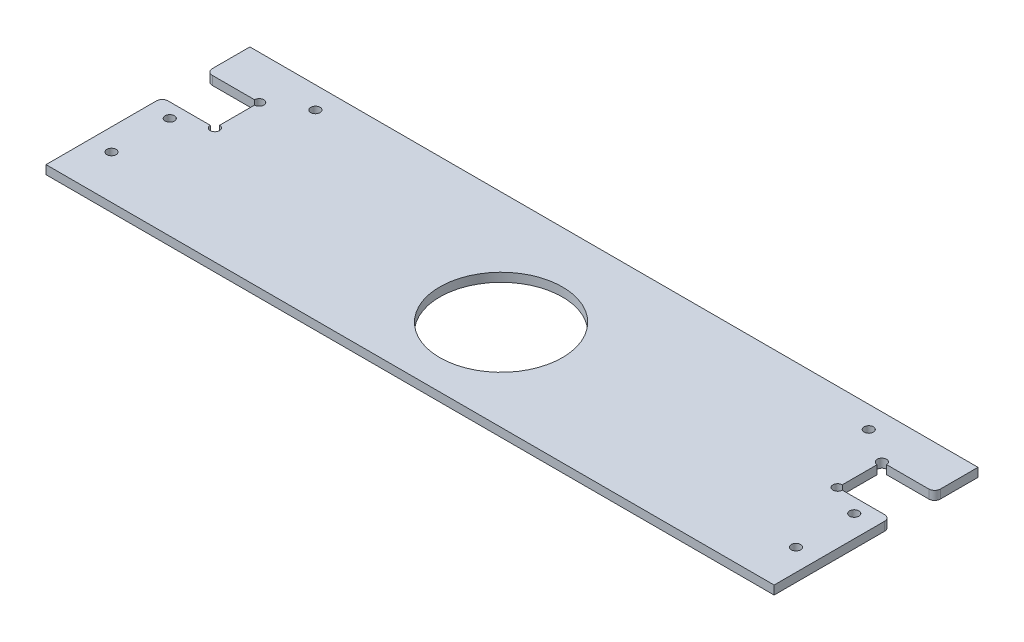
ISO-10303-21;
HEADER;
FILE_DESCRIPTION(('STEP AP214'),'2;1');
FILE_NAME('part.step','',(''),(''),'','','');
FILE_SCHEMA(('AUTOMOTIVE_DESIGN { 1 0 10303 214 1 1 1 1 }'));
ENDSEC;
DATA;
#1=APPLICATION_CONTEXT('core data for automotive mechanical design processes');
#2=APPLICATION_PROTOCOL_DEFINITION('international standard','automotive_design',2000,#1);
#3=PRODUCT_CONTEXT('',#1,'mechanical');
#4=PRODUCT('Part','Part','',(#3));
#5=PRODUCT_RELATED_PRODUCT_CATEGORY('part','',(#4));
#6=PRODUCT_DEFINITION_FORMATION('','',#4);
#7=PRODUCT_DEFINITION_CONTEXT('part definition',#1,'design');
#8=PRODUCT_DEFINITION('design','',#6,#7);
#9=PRODUCT_DEFINITION_SHAPE('','',#8);
#10=(LENGTH_UNIT() NAMED_UNIT(*) SI_UNIT(.MILLI.,.METRE.));
#11=(NAMED_UNIT(*) PLANE_ANGLE_UNIT() SI_UNIT($,.RADIAN.));
#12=(NAMED_UNIT(*) SI_UNIT($,.STERADIAN.) SOLID_ANGLE_UNIT());
#13=UNCERTAINTY_MEASURE_WITH_UNIT(LENGTH_MEASURE(1.E-05),#10,'distance_accuracy_value','');
#14=(GEOMETRIC_REPRESENTATION_CONTEXT(3) GLOBAL_UNCERTAINTY_ASSIGNED_CONTEXT((#13)) GLOBAL_UNIT_ASSIGNED_CONTEXT((#10,
#11,#12)) REPRESENTATION_CONTEXT('',''));
#15=CARTESIAN_POINT('',(0.,0.,0.));
#16=DIRECTION('',(0.,0.,1.));
#17=DIRECTION('',(1.,0.,0.));
#18=AXIS2_PLACEMENT_3D('',#15,#16,#17);
#19=CARTESIAN_POINT('',(125.,3.,35.));
#20=DIRECTION('',(-1.,0.,0.));
#21=DIRECTION('',(0.,0.,1.));
#22=AXIS2_PLACEMENT_3D('',#19,#20,#21);
#23=PLANE('',#22);
#24=DIRECTION('',(0.,0.,-1.));
#25=VECTOR('',#24,1.);
#26=CARTESIAN_POINT('',(125.,3.,35.));
#27=LINE('',#26,#25);
#28=CARTESIAN_POINT('',(125.,3.,-22.1));
#29=VERTEX_POINT('',#28);
#30=CARTESIAN_POINT('',(125.,3.,-35.));
#31=VERTEX_POINT('',#30);
#32=EDGE_CURVE('E272',#29,#31,#27,.T.);
#33=ORIENTED_EDGE('',*,*,#32,.F.);
#34=DIRECTION('',(0.,1.,0.));
#35=VECTOR('',#34,1.);
#36=CARTESIAN_POINT('',(125.,3.,-22.1));
#37=LINE('',#36,#35);
#38=CARTESIAN_POINT('',(125.,0.,-22.1));
#39=VERTEX_POINT('',#38);
#40=EDGE_CURVE('E316',#29,#39,#37,.F.);
#41=ORIENTED_EDGE('',*,*,#40,.T.);
#42=DIRECTION('',(0.,0.,-1.));
#43=VECTOR('',#42,1.);
#44=CARTESIAN_POINT('',(125.,0.,35.));
#45=LINE('',#44,#43);
#46=CARTESIAN_POINT('',(125.,0.,-35.));
#47=VERTEX_POINT('',#46);
#48=EDGE_CURVE('E265',#39,#47,#45,.T.);
#49=ORIENTED_EDGE('',*,*,#48,.T.);
#50=DIRECTION('',(0.,-1.,0.));
#51=VECTOR('',#50,1.);
#52=CARTESIAN_POINT('',(125.,3.,-35.));
#53=LINE('',#52,#51);
#54=EDGE_CURVE('E300',#31,#47,#53,.T.);
#55=ORIENTED_EDGE('',*,*,#54,.F.);
#56=EDGE_LOOP('',(#33,#41,#49,#55));
#57=FACE_BOUND('',#56,.T.);
#58=ADVANCED_FACE('F41',(#57),#23,.F.);
#59=CARTESIAN_POINT('',(-125.,3.,35.));
#60=DIRECTION('',(1.,0.,0.));
#61=DIRECTION('',(0.,0.,-1.));
#62=AXIS2_PLACEMENT_3D('',#59,#60,#61);
#63=PLANE('',#62);
#64=DIRECTION('',(0.,0.,1.));
#65=VECTOR('',#64,1.);
#66=CARTESIAN_POINT('',(-125.,0.,35.));
#67=LINE('',#66,#65);
#68=CARTESIAN_POINT('',(-125.,0.,-35.));
#69=VERTEX_POINT('',#68);
#70=CARTESIAN_POINT('',(-125.,0.,-22.1));
#71=VERTEX_POINT('',#70);
#72=EDGE_CURVE('E287',#69,#71,#67,.T.);
#73=ORIENTED_EDGE('',*,*,#72,.T.);
#74=DIRECTION('',(0.,1.,0.));
#75=VECTOR('',#74,1.);
#76=CARTESIAN_POINT('',(-125.,3.,-22.1));
#77=LINE('',#76,#75);
#78=CARTESIAN_POINT('',(-125.,3.,-22.1));
#79=VERTEX_POINT('',#78);
#80=EDGE_CURVE('E332',#71,#79,#77,.T.);
#81=ORIENTED_EDGE('',*,*,#80,.T.);
#82=DIRECTION('',(0.,0.,1.));
#83=VECTOR('',#82,1.);
#84=CARTESIAN_POINT('',(-125.,3.,35.));
#85=LINE('',#84,#83);
#86=CARTESIAN_POINT('',(-125.,3.,-35.));
#87=VERTEX_POINT('',#86);
#88=EDGE_CURVE('E275',#87,#79,#85,.T.);
#89=ORIENTED_EDGE('',*,*,#88,.F.);
#90=DIRECTION('',(0.,-1.,0.));
#91=VECTOR('',#90,1.);
#92=CARTESIAN_POINT('',(-125.,3.,-35.));
#93=LINE('',#92,#91);
#94=EDGE_CURVE('E297',#87,#69,#93,.T.);
#95=ORIENTED_EDGE('',*,*,#94,.T.);
#96=EDGE_LOOP('',(#73,#81,#89,#95));
#97=FACE_BOUND('',#96,.T.);
#98=ADVANCED_FACE('F387',(#97),#63,.F.);
#99=CARTESIAN_POINT('',(125.,0.,35.));
#100=VERTEX_POINT('',#99);
#101=CARTESIAN_POINT('',(125.,0.,-2.9));
#102=VERTEX_POINT('',#101);
#103=EDGE_CURVE('E281',#100,#102,#45,.T.);
#104=ORIENTED_EDGE('',*,*,#103,.T.);
#105=DIRECTION('',(0.,1.,0.));
#106=VECTOR('',#105,1.);
#107=CARTESIAN_POINT('',(125.,3.,-2.9));
#108=LINE('',#107,#106);
#109=CARTESIAN_POINT('',(125.,3.,-2.9));
#110=VERTEX_POINT('',#109);
#111=EDGE_CURVE('E326',#102,#110,#108,.T.);
#112=ORIENTED_EDGE('',*,*,#111,.T.);
#113=CARTESIAN_POINT('',(125.,3.,35.));
#114=VERTEX_POINT('',#113);
#115=EDGE_CURVE('E268',#114,#110,#27,.T.);
#116=ORIENTED_EDGE('',*,*,#115,.F.);
#117=DIRECTION('',(0.,-1.,0.));
#118=VECTOR('',#117,1.);
#119=CARTESIAN_POINT('',(125.,3.,35.));
#120=LINE('',#119,#118);
#121=EDGE_CURVE('E280',#114,#100,#120,.T.);
#122=ORIENTED_EDGE('',*,*,#121,.T.);
#123=EDGE_LOOP('',(#104,#112,#116,#122));
#124=FACE_BOUND('',#123,.T.);
#125=ADVANCED_FACE('F451',(#124),#23,.F.);
#126=CARTESIAN_POINT('',(-125.,3.,-35.));
#127=DIRECTION('',(0.,0.,1.));
#128=DIRECTION('',(1.,0.,0.));
#129=AXIS2_PLACEMENT_3D('',#126,#127,#128);
#130=PLANE('',#129);
#131=DIRECTION('',(-1.,0.,0.));
#132=VECTOR('',#131,1.);
#133=CARTESIAN_POINT('',(-125.,0.,-35.));
#134=LINE('',#133,#132);
#135=EDGE_CURVE('E284',#47,#69,#134,.T.);
#136=ORIENTED_EDGE('',*,*,#135,.T.);
#137=ORIENTED_EDGE('',*,*,#94,.F.);
#138=DIRECTION('',(-1.,0.,0.));
#139=VECTOR('',#138,1.);
#140=CARTESIAN_POINT('',(-125.,3.,-35.));
#141=LINE('',#140,#139);
#142=EDGE_CURVE('E271',#31,#87,#141,.T.);
#143=ORIENTED_EDGE('',*,*,#142,.F.);
#144=ORIENTED_EDGE('',*,*,#54,.T.);
#145=EDGE_LOOP('',(#136,#137,#143,#144));
#146=FACE_BOUND('',#145,.T.);
#147=ADVANCED_FACE('F393',(#146),#130,.F.);
#148=CARTESIAN_POINT('',(-125.,3.,-2.9));
#149=VERTEX_POINT('',#148);
#150=CARTESIAN_POINT('',(-125.,3.,35.));
#151=VERTEX_POINT('',#150);
#152=EDGE_CURVE('E274',#149,#151,#85,.T.);
#153=ORIENTED_EDGE('',*,*,#152,.F.);
#154=DIRECTION('',(0.,1.,0.));
#155=VECTOR('',#154,1.);
#156=CARTESIAN_POINT('',(-125.,3.,-2.9));
#157=LINE('',#156,#155);
#158=CARTESIAN_POINT('',(-125.,0.,-2.9));
#159=VERTEX_POINT('',#158);
#160=EDGE_CURVE('E341',#149,#159,#157,.F.);
#161=ORIENTED_EDGE('',*,*,#160,.T.);
#162=CARTESIAN_POINT('',(-125.,0.,35.));
#163=VERTEX_POINT('',#162);
#164=EDGE_CURVE('E286',#159,#163,#67,.T.);
#165=ORIENTED_EDGE('',*,*,#164,.T.);
#166=DIRECTION('',(0.,-1.,0.));
#167=VECTOR('',#166,1.);
#168=CARTESIAN_POINT('',(-125.,3.,35.));
#169=LINE('',#168,#167);
#170=EDGE_CURVE('E294',#151,#163,#169,.T.);
#171=ORIENTED_EDGE('',*,*,#170,.F.);
#172=EDGE_LOOP('',(#153,#161,#165,#171));
#173=FACE_BOUND('',#172,.T.);
#174=ADVANCED_FACE('F457',(#173),#63,.F.);
#175=CARTESIAN_POINT('',(-125.,3.,35.));
#176=DIRECTION('',(0.,0.,-1.));
#177=DIRECTION('',(-1.,0.,0.));
#178=AXIS2_PLACEMENT_3D('',#175,#176,#177);
#179=PLANE('',#178);
#180=DIRECTION('',(1.,0.,0.));
#181=VECTOR('',#180,1.);
#182=CARTESIAN_POINT('',(-125.,0.,35.));
#183=LINE('',#182,#181);
#184=EDGE_CURVE('E290',#163,#100,#183,.T.);
#185=ORIENTED_EDGE('',*,*,#184,.T.);
#186=ORIENTED_EDGE('',*,*,#121,.F.);
#187=DIRECTION('',(1.,0.,0.));
#188=VECTOR('',#187,1.);
#189=CARTESIAN_POINT('',(-125.,3.,35.));
#190=LINE('',#189,#188);
#191=EDGE_CURVE('E278',#151,#114,#190,.T.);
#192=ORIENTED_EDGE('',*,*,#191,.F.);
#193=ORIENTED_EDGE('',*,*,#170,.T.);
#194=EDGE_LOOP('',(#185,#186,#192,#193));
#195=FACE_BOUND('',#194,.T.);
#196=ADVANCED_FACE('F418',(#195),#179,.F.);
#197=CARTESIAN_POINT('',(0.,3.,0.));
#198=DIRECTION('',(0.,-1.,0.));
#199=DIRECTION('',(0.,0.,-1.));
#200=AXIS2_PLACEMENT_3D('',#197,#198,#199);
#201=PLANE('',#200);
#202=CARTESIAN_POINT('',(0.,3.,3.74999999999999));
#203=DIRECTION('',(0.,1.,0.));
#204=DIRECTION('',(0.,0.,1.));
#205=AXIS2_PLACEMENT_3D('',#202,#203,#204);
#206=CIRCLE('',#205,21.05);
#207=CARTESIAN_POINT('',(0.,3.,24.8));
#208=VERTEX_POINT('',#207);
#209=EDGE_CURVE('E361',#208,#208,#206,.T.);
#210=ORIENTED_EDGE('',*,*,#209,.F.);
#211=EDGE_LOOP('',(#210));
#212=FACE_BOUND('',#211,.T.);
#213=CARTESIAN_POINT('',(95.,3.,-27.5));
#214=DIRECTION('',(0.,1.,0.));
#215=DIRECTION('',(0.,0.,1.));
#216=AXIS2_PLACEMENT_3D('',#213,#214,#215);
#217=CIRCLE('',#216,1.6);
#218=CARTESIAN_POINT('',(95.,3.,-25.9));
#219=VERTEX_POINT('',#218);
#220=EDGE_CURVE('E238',#219,#219,#217,.T.);
#221=ORIENTED_EDGE('',*,*,#220,.F.);
#222=EDGE_LOOP('',(#221));
#223=FACE_BOUND('',#222,.T.);
#224=CARTESIAN_POINT('',(-117.5,3.,0.));
#225=DIRECTION('',(0.,1.,0.));
#226=DIRECTION('',(0.,0.,1.));
#227=AXIS2_PLACEMENT_3D('',#224,#225,#226);
#228=CIRCLE('',#227,1.60000000000001);
#229=CARTESIAN_POINT('',(-117.5,3.,1.60000000000001));
#230=VERTEX_POINT('',#229);
#231=EDGE_CURVE('E245',#230,#230,#228,.T.);
#232=ORIENTED_EDGE('',*,*,#231,.F.);
#233=EDGE_LOOP('',(#232));
#234=FACE_BOUND('',#233,.T.);
#235=CARTESIAN_POINT('',(-117.5,3.,20.));
#236=DIRECTION('',(0.,1.,0.));
#237=DIRECTION('',(0.,0.,1.));
#238=AXIS2_PLACEMENT_3D('',#235,#236,#237);
#239=CIRCLE('',#238,1.6);
#240=CARTESIAN_POINT('',(-117.5,3.,21.6));
#241=VERTEX_POINT('',#240);
#242=EDGE_CURVE('E251',#241,#241,#239,.T.);
#243=ORIENTED_EDGE('',*,*,#242,.F.);
#244=EDGE_LOOP('',(#243));
#245=FACE_BOUND('',#244,.T.);
#246=CARTESIAN_POINT('',(117.5,3.,20.));
#247=DIRECTION('',(0.,1.,0.));
#248=DIRECTION('',(0.,0.,-1.));
#249=AXIS2_PLACEMENT_3D('',#246,#247,#248);
#250=CIRCLE('',#249,1.6);
#251=CARTESIAN_POINT('',(117.5,3.,18.4));
#252=VERTEX_POINT('',#251);
#253=EDGE_CURVE('E257',#252,#252,#250,.T.);
#254=ORIENTED_EDGE('',*,*,#253,.F.);
#255=EDGE_LOOP('',(#254));
#256=FACE_BOUND('',#255,.T.);
#257=CARTESIAN_POINT('',(117.5,3.,0.));
#258=DIRECTION('',(0.,1.,0.));
#259=DIRECTION('',(0.,0.,-1.));
#260=AXIS2_PLACEMENT_3D('',#257,#258,#259);
#261=CIRCLE('',#260,1.60000000000001);
#262=CARTESIAN_POINT('',(117.5,3.,-1.60000000000003));
#263=VERTEX_POINT('',#262);
#264=EDGE_CURVE('E230',#263,#263,#261,.T.);
#265=ORIENTED_EDGE('',*,*,#264,.F.);
#266=EDGE_LOOP('',(#265));
#267=FACE_BOUND('',#266,.T.);
#268=CARTESIAN_POINT('',(-95.,3.,-27.5));
#269=DIRECTION('',(0.,1.,0.));
#270=DIRECTION('',(0.,0.,1.));
#271=AXIS2_PLACEMENT_3D('',#268,#269,#270);
#272=CIRCLE('',#271,1.6);
#273=CARTESIAN_POINT('',(-95.,3.,-25.9));
#274=VERTEX_POINT('',#273);
#275=EDGE_CURVE('E241',#274,#274,#272,.T.);
#276=ORIENTED_EDGE('',*,*,#275,.F.);
#277=EDGE_LOOP('',(#276));
#278=FACE_BOUND('',#277,.T.);
#279=DIRECTION('',(0.,0.,1.));
#280=VECTOR('',#279,1.);
#281=CARTESIAN_POINT('',(106.9,3.,-20.1));
#282=LINE('',#281,#280);
#283=CARTESIAN_POINT('',(106.9,3.,-18.5));
#284=VERTEX_POINT('',#283);
#285=CARTESIAN_POINT('',(106.9,3.,-6.50000000000001));
#286=VERTEX_POINT('',#285);
#287=EDGE_CURVE('E216',#284,#286,#282,.T.);
#288=ORIENTED_EDGE('',*,*,#287,.F.);
#289=CARTESIAN_POINT('',(106.9,3.,-20.1));
#290=DIRECTION('',(0.,1.,0.));
#291=DIRECTION('',(0.,0.,1.));
#292=AXIS2_PLACEMENT_3D('',#289,#290,#291);
#293=CIRCLE('',#292,1.6);
#294=CARTESIAN_POINT('',(108.5,3.,-20.1));
#295=VERTEX_POINT('',#294);
#296=EDGE_CURVE('E64',#295,#284,#293,.T.);
#297=ORIENTED_EDGE('',*,*,#296,.F.);
#298=DIRECTION('',(-1.,0.,0.));
#299=VECTOR('',#298,1.);
#300=CARTESIAN_POINT('',(125.,3.,-20.1));
#301=LINE('',#300,#299);
#302=CARTESIAN_POINT('',(123.,3.,-20.1));
#303=VERTEX_POINT('',#302);
#304=EDGE_CURVE('E210',#303,#295,#301,.T.);
#305=ORIENTED_EDGE('',*,*,#304,.F.);
#306=CARTESIAN_POINT('',(123.,3.,-22.1));
#307=DIRECTION('',(0.,-1.,0.));
#308=DIRECTION('',(0.,0.,-1.));
#309=AXIS2_PLACEMENT_3D('',#306,#307,#308);
#310=CIRCLE('',#309,2.);
#311=EDGE_CURVE('E314',#303,#29,#310,.F.);
#312=ORIENTED_EDGE('',*,*,#311,.T.);
#313=ORIENTED_EDGE('',*,*,#32,.T.);
#314=ORIENTED_EDGE('',*,*,#142,.T.);
#315=ORIENTED_EDGE('',*,*,#88,.T.);
#316=CARTESIAN_POINT('',(-123.,3.,-22.1));
#317=DIRECTION('',(0.,-1.,0.));
#318=DIRECTION('',(0.,0.,-1.));
#319=AXIS2_PLACEMENT_3D('',#316,#317,#318);
#320=CIRCLE('',#319,2.);
#321=CARTESIAN_POINT('',(-123.,3.,-20.1));
#322=VERTEX_POINT('',#321);
#323=EDGE_CURVE('E308',#79,#322,#320,.F.);
#324=ORIENTED_EDGE('',*,*,#323,.T.);
#325=DIRECTION('',(-1.,0.,0.));
#326=VECTOR('',#325,1.);
#327=CARTESIAN_POINT('',(-125.,3.,-20.1));
#328=LINE('',#327,#326);
#329=CARTESIAN_POINT('',(-108.5,3.,-20.1));
#330=VERTEX_POINT('',#329);
#331=EDGE_CURVE('E205',#330,#322,#328,.T.);
#332=ORIENTED_EDGE('',*,*,#331,.F.);
#333=CARTESIAN_POINT('',(-106.9,3.,-20.1));
#334=DIRECTION('',(0.,1.,0.));
#335=DIRECTION('',(0.,0.,1.));
#336=AXIS2_PLACEMENT_3D('',#333,#334,#335);
#337=CIRCLE('',#336,1.6);
#338=CARTESIAN_POINT('',(-106.9,3.,-18.5));
#339=VERTEX_POINT('',#338);
#340=EDGE_CURVE('E187',#339,#330,#337,.T.);
#341=ORIENTED_EDGE('',*,*,#340,.F.);
#342=DIRECTION('',(0.,0.,-1.));
#343=VECTOR('',#342,1.);
#344=CARTESIAN_POINT('',(-106.9,3.,-20.1));
#345=LINE('',#344,#343);
#346=CARTESIAN_POINT('',(-106.9,3.,-6.50000000000001));
#347=VERTEX_POINT('',#346);
#348=EDGE_CURVE('E195',#347,#339,#345,.T.);
#349=ORIENTED_EDGE('',*,*,#348,.F.);
#350=CARTESIAN_POINT('',(-106.9,3.,-4.9));
#351=DIRECTION('',(0.,1.,0.));
#352=DIRECTION('',(0.,0.,1.));
#353=AXIS2_PLACEMENT_3D('',#350,#351,#352);
#354=CIRCLE('',#353,1.60000000000001);
#355=CARTESIAN_POINT('',(-108.5,3.,-4.9));
#356=VERTEX_POINT('',#355);
#357=EDGE_CURVE('E176',#356,#347,#354,.T.);
#358=ORIENTED_EDGE('',*,*,#357,.F.);
#359=DIRECTION('',(1.,0.,0.));
#360=VECTOR('',#359,1.);
#361=CARTESIAN_POINT('',(-125.,3.,-4.9));
#362=LINE('',#361,#360);
#363=CARTESIAN_POINT('',(-123.,3.,-4.9));
#364=VERTEX_POINT('',#363);
#365=EDGE_CURVE('E206',#364,#356,#362,.T.);
#366=ORIENTED_EDGE('',*,*,#365,.F.);
#367=CARTESIAN_POINT('',(-123.,3.,-2.9));
#368=DIRECTION('',(0.,-1.,0.));
#369=DIRECTION('',(0.,0.,-1.));
#370=AXIS2_PLACEMENT_3D('',#367,#368,#369);
#371=CIRCLE('',#370,2.);
#372=EDGE_CURVE('E306',#364,#149,#371,.F.);
#373=ORIENTED_EDGE('',*,*,#372,.T.);
#374=ORIENTED_EDGE('',*,*,#152,.T.);
#375=ORIENTED_EDGE('',*,*,#191,.T.);
#376=ORIENTED_EDGE('',*,*,#115,.T.);
#377=CARTESIAN_POINT('',(123.,3.,-2.9));
#378=DIRECTION('',(0.,-1.,0.));
#379=DIRECTION('',(0.,0.,-1.));
#380=AXIS2_PLACEMENT_3D('',#377,#378,#379);
#381=CIRCLE('',#380,2.);
#382=CARTESIAN_POINT('',(123.,3.,-4.9));
#383=VERTEX_POINT('',#382);
#384=EDGE_CURVE('E311',#110,#383,#381,.F.);
#385=ORIENTED_EDGE('',*,*,#384,.T.);
#386=DIRECTION('',(1.,0.,0.));
#387=VECTOR('',#386,1.);
#388=CARTESIAN_POINT('',(125.,3.,-4.9));
#389=LINE('',#388,#387);
#390=CARTESIAN_POINT('',(108.5,3.,-4.9));
#391=VERTEX_POINT('',#390);
#392=EDGE_CURVE('E214',#391,#383,#389,.T.);
#393=ORIENTED_EDGE('',*,*,#392,.F.);
#394=CARTESIAN_POINT('',(106.9,3.,-4.9));
#395=DIRECTION('',(0.,1.,0.));
#396=DIRECTION('',(0.,0.,1.));
#397=AXIS2_PLACEMENT_3D('',#394,#395,#396);
#398=CIRCLE('',#397,1.60000000000001);
#399=EDGE_CURVE('E407',#286,#391,#398,.T.);
#400=ORIENTED_EDGE('',*,*,#399,.F.);
#401=EDGE_LOOP('',(#288,#297,#305,#312,#313,#314,#315,#324,#332,#341,#349,#358,#366,#373,#374,
#375,#376,#385,#393,#400));
#402=FACE_BOUND('',#401,.T.);
#403=ADVANCED_FACE('F203',(#212,#223,#234,#245,#256,#267,#278,#402),#201,.F.);
#404=CARTESIAN_POINT('',(0.,0.,0.));
#405=DIRECTION('',(0.,-1.,0.));
#406=DIRECTION('',(0.,0.,-1.));
#407=AXIS2_PLACEMENT_3D('',#404,#405,#406);
#408=PLANE('',#407);
#409=CARTESIAN_POINT('',(0.,0.,3.74999999999999));
#410=DIRECTION('',(0.,1.,0.));
#411=DIRECTION('',(0.,0.,1.));
#412=AXIS2_PLACEMENT_3D('',#409,#410,#411);
#413=CIRCLE('',#412,21.05);
#414=CARTESIAN_POINT('',(0.,0.,24.8));
#415=VERTEX_POINT('',#414);
#416=EDGE_CURVE('E357',#415,#415,#413,.T.);
#417=ORIENTED_EDGE('',*,*,#416,.T.);
#418=EDGE_LOOP('',(#417));
#419=FACE_BOUND('',#418,.T.);
#420=CARTESIAN_POINT('',(106.9,0.,-20.1));
#421=DIRECTION('',(0.,1.,0.));
#422=DIRECTION('',(0.,0.,1.));
#423=AXIS2_PLACEMENT_3D('',#420,#421,#422);
#424=CIRCLE('',#423,1.6);
#425=CARTESIAN_POINT('',(108.5,0.,-20.1));
#426=VERTEX_POINT('',#425);
#427=CARTESIAN_POINT('',(106.9,0.,-18.5));
#428=VERTEX_POINT('',#427);
#429=EDGE_CURVE('E354',#426,#428,#424,.T.);
#430=ORIENTED_EDGE('',*,*,#429,.T.);
#431=DIRECTION('',(0.,0.,1.));
#432=VECTOR('',#431,1.);
#433=CARTESIAN_POINT('',(106.9,0.,-20.1));
#434=LINE('',#433,#432);
#435=CARTESIAN_POINT('',(106.9,0.,-6.50000000000001));
#436=VERTEX_POINT('',#435);
#437=EDGE_CURVE('E224',#428,#436,#434,.T.);
#438=ORIENTED_EDGE('',*,*,#437,.T.);
#439=CARTESIAN_POINT('',(106.9,0.,-4.9));
#440=DIRECTION('',(0.,1.,0.));
#441=DIRECTION('',(0.,0.,1.));
#442=AXIS2_PLACEMENT_3D('',#439,#440,#441);
#443=CIRCLE('',#442,1.60000000000001);
#444=CARTESIAN_POINT('',(108.5,0.,-4.9));
#445=VERTEX_POINT('',#444);
#446=EDGE_CURVE('E56',#436,#445,#443,.T.);
#447=ORIENTED_EDGE('',*,*,#446,.T.);
#448=DIRECTION('',(1.,0.,0.));
#449=VECTOR('',#448,1.);
#450=CARTESIAN_POINT('',(125.,0.,-4.9));
#451=LINE('',#450,#449);
#452=CARTESIAN_POINT('',(123.,0.,-4.9));
#453=VERTEX_POINT('',#452);
#454=EDGE_CURVE('E222',#445,#453,#451,.T.);
#455=ORIENTED_EDGE('',*,*,#454,.T.);
#456=CARTESIAN_POINT('',(123.,0.,-2.9));
#457=DIRECTION('',(0.,-1.,0.));
#458=DIRECTION('',(0.,0.,-1.));
#459=AXIS2_PLACEMENT_3D('',#456,#457,#458);
#460=CIRCLE('',#459,2.);
#461=EDGE_CURVE('E322',#453,#102,#460,.T.);
#462=ORIENTED_EDGE('',*,*,#461,.T.);
#463=ORIENTED_EDGE('',*,*,#103,.F.);
#464=ORIENTED_EDGE('',*,*,#184,.F.);
#465=ORIENTED_EDGE('',*,*,#164,.F.);
#466=CARTESIAN_POINT('',(-123.,0.,-2.9));
#467=DIRECTION('',(0.,-1.,0.));
#468=DIRECTION('',(0.,0.,-1.));
#469=AXIS2_PLACEMENT_3D('',#466,#467,#468);
#470=CIRCLE('',#469,2.);
#471=CARTESIAN_POINT('',(-123.,0.,-4.9));
#472=VERTEX_POINT('',#471);
#473=EDGE_CURVE('E318',#159,#472,#470,.T.);
#474=ORIENTED_EDGE('',*,*,#473,.T.);
#475=DIRECTION('',(1.,0.,0.));
#476=VECTOR('',#475,1.);
#477=CARTESIAN_POINT('',(-125.,0.,-4.9));
#478=LINE('',#477,#476);
#479=CARTESIAN_POINT('',(-108.5,0.,-4.9));
#480=VERTEX_POINT('',#479);
#481=EDGE_CURVE('E208',#472,#480,#478,.T.);
#482=ORIENTED_EDGE('',*,*,#481,.T.);
#483=CARTESIAN_POINT('',(-106.9,0.,-4.9));
#484=DIRECTION('',(0.,1.,0.));
#485=DIRECTION('',(0.,0.,1.));
#486=AXIS2_PLACEMENT_3D('',#483,#484,#485);
#487=CIRCLE('',#486,1.60000000000001);
#488=CARTESIAN_POINT('',(-106.9,0.,-6.50000000000001));
#489=VERTEX_POINT('',#488);
#490=EDGE_CURVE('E188',#480,#489,#487,.T.);
#491=ORIENTED_EDGE('',*,*,#490,.T.);
#492=DIRECTION('',(0.,0.,-1.));
#493=VECTOR('',#492,1.);
#494=CARTESIAN_POINT('',(-106.9,0.,-20.1));
#495=LINE('',#494,#493);
#496=CARTESIAN_POINT('',(-106.9,0.,-18.5));
#497=VERTEX_POINT('',#496);
#498=EDGE_CURVE('E197',#489,#497,#495,.T.);
#499=ORIENTED_EDGE('',*,*,#498,.T.);
#500=CARTESIAN_POINT('',(-106.9,0.,-20.1));
#501=DIRECTION('',(0.,1.,0.));
#502=DIRECTION('',(0.,0.,1.));
#503=AXIS2_PLACEMENT_3D('',#500,#501,#502);
#504=CIRCLE('',#503,1.6);
#505=CARTESIAN_POINT('',(-108.5,0.,-20.1));
#506=VERTEX_POINT('',#505);
#507=EDGE_CURVE('E199',#497,#506,#504,.T.);
#508=ORIENTED_EDGE('',*,*,#507,.T.);
#509=DIRECTION('',(-1.,0.,0.));
#510=VECTOR('',#509,1.);
#511=CARTESIAN_POINT('',(-125.,0.,-20.1));
#512=LINE('',#511,#510);
#513=CARTESIAN_POINT('',(-123.,0.,-20.1));
#514=VERTEX_POINT('',#513);
#515=EDGE_CURVE('E237',#506,#514,#512,.T.);
#516=ORIENTED_EDGE('',*,*,#515,.T.);
#517=CARTESIAN_POINT('',(-123.,0.,-22.1));
#518=DIRECTION('',(0.,-1.,0.));
#519=DIRECTION('',(0.,0.,-1.));
#520=AXIS2_PLACEMENT_3D('',#517,#518,#519);
#521=CIRCLE('',#520,2.);
#522=EDGE_CURVE('E320',#514,#71,#521,.T.);
#523=ORIENTED_EDGE('',*,*,#522,.T.);
#524=ORIENTED_EDGE('',*,*,#72,.F.);
#525=ORIENTED_EDGE('',*,*,#135,.F.);
#526=ORIENTED_EDGE('',*,*,#48,.F.);
#527=CARTESIAN_POINT('',(123.,0.,-22.1));
#528=DIRECTION('',(0.,-1.,0.));
#529=DIRECTION('',(0.,0.,-1.));
#530=AXIS2_PLACEMENT_3D('',#527,#528,#529);
#531=CIRCLE('',#530,2.);
#532=CARTESIAN_POINT('',(123.,0.,-20.1));
#533=VERTEX_POINT('',#532);
#534=EDGE_CURVE('E324',#39,#533,#531,.T.);
#535=ORIENTED_EDGE('',*,*,#534,.T.);
#536=DIRECTION('',(-1.,0.,0.));
#537=VECTOR('',#536,1.);
#538=CARTESIAN_POINT('',(125.,0.,-20.1));
#539=LINE('',#538,#537);
#540=EDGE_CURVE('E217',#533,#426,#539,.T.);
#541=ORIENTED_EDGE('',*,*,#540,.T.);
#542=EDGE_LOOP('',(#430,#438,#447,#455,#462,#463,#464,#465,#474,#482,#491,#499,#508,#516,#523,
#524,#525,#526,#535,#541));
#543=FACE_BOUND('',#542,.T.);
#544=CARTESIAN_POINT('',(95.,0.,-27.5));
#545=DIRECTION('',(0.,1.,0.));
#546=DIRECTION('',(0.,0.,1.));
#547=AXIS2_PLACEMENT_3D('',#544,#545,#546);
#548=CIRCLE('',#547,1.6);
#549=CARTESIAN_POINT('',(95.,0.,-25.9));
#550=VERTEX_POINT('',#549);
#551=EDGE_CURVE('E242',#550,#550,#548,.T.);
#552=ORIENTED_EDGE('',*,*,#551,.T.);
#553=EDGE_LOOP('',(#552));
#554=FACE_BOUND('',#553,.T.);
#555=CARTESIAN_POINT('',(-117.5,0.,0.));
#556=DIRECTION('',(0.,1.,0.));
#557=DIRECTION('',(0.,0.,1.));
#558=AXIS2_PLACEMENT_3D('',#555,#556,#557);
#559=CIRCLE('',#558,1.60000000000001);
#560=CARTESIAN_POINT('',(-117.5,0.,1.60000000000001));
#561=VERTEX_POINT('',#560);
#562=EDGE_CURVE('E248',#561,#561,#559,.T.);
#563=ORIENTED_EDGE('',*,*,#562,.T.);
#564=EDGE_LOOP('',(#563));
#565=FACE_BOUND('',#564,.T.);
#566=CARTESIAN_POINT('',(-117.5,0.,20.));
#567=DIRECTION('',(0.,1.,0.));
#568=DIRECTION('',(0.,0.,1.));
#569=AXIS2_PLACEMENT_3D('',#566,#567,#568);
#570=CIRCLE('',#569,1.6);
#571=CARTESIAN_POINT('',(-117.5,0.,21.6));
#572=VERTEX_POINT('',#571);
#573=EDGE_CURVE('E254',#572,#572,#570,.T.);
#574=ORIENTED_EDGE('',*,*,#573,.T.);
#575=EDGE_LOOP('',(#574));
#576=FACE_BOUND('',#575,.T.);
#577=CARTESIAN_POINT('',(117.5,0.,20.));
#578=DIRECTION('',(0.,1.,0.));
#579=DIRECTION('',(0.,0.,-1.));
#580=AXIS2_PLACEMENT_3D('',#577,#578,#579);
#581=CIRCLE('',#580,1.6);
#582=CARTESIAN_POINT('',(117.5,0.,18.4));
#583=VERTEX_POINT('',#582);
#584=EDGE_CURVE('E233',#583,#583,#581,.T.);
#585=ORIENTED_EDGE('',*,*,#584,.T.);
#586=EDGE_LOOP('',(#585));
#587=FACE_BOUND('',#586,.T.);
#588=CARTESIAN_POINT('',(117.5,0.,0.));
#589=DIRECTION('',(0.,1.,0.));
#590=DIRECTION('',(0.,0.,-1.));
#591=AXIS2_PLACEMENT_3D('',#588,#589,#590);
#592=CIRCLE('',#591,1.60000000000001);
#593=CARTESIAN_POINT('',(117.5,0.,-1.60000000000003));
#594=VERTEX_POINT('',#593);
#595=EDGE_CURVE('E234',#594,#594,#592,.T.);
#596=ORIENTED_EDGE('',*,*,#595,.T.);
#597=EDGE_LOOP('',(#596));
#598=FACE_BOUND('',#597,.T.);
#599=CARTESIAN_POINT('',(-95.,0.,-27.5));
#600=DIRECTION('',(0.,1.,0.));
#601=DIRECTION('',(0.,0.,1.));
#602=AXIS2_PLACEMENT_3D('',#599,#600,#601);
#603=CIRCLE('',#602,1.6);
#604=CARTESIAN_POINT('',(-95.,0.,-25.9));
#605=VERTEX_POINT('',#604);
#606=EDGE_CURVE('E262',#605,#605,#603,.T.);
#607=ORIENTED_EDGE('',*,*,#606,.T.);
#608=EDGE_LOOP('',(#607));
#609=FACE_BOUND('',#608,.T.);
#610=ADVANCED_FACE('F351',(#419,#543,#554,#565,#576,#587,#598,#609),#408,.T.);
#611=CARTESIAN_POINT('',(-95.,0.,-27.5));
#612=DIRECTION('',(0.,1.,0.));
#613=DIRECTION('',(0.,0.,1.));
#614=AXIS2_PLACEMENT_3D('',#611,#612,#613);
#615=CYLINDRICAL_SURFACE('',#614,1.6);
#616=ORIENTED_EDGE('',*,*,#606,.F.);
#617=EDGE_LOOP('',(#616));
#618=FACE_BOUND('',#617,.T.);
#619=ORIENTED_EDGE('',*,*,#275,.T.);
#620=EDGE_LOOP('',(#619));
#621=FACE_BOUND('',#620,.T.);
#622=ADVANCED_FACE('F432',(#618,#621),#615,.F.);
#623=CARTESIAN_POINT('',(117.5,0.,0.));
#624=DIRECTION('',(0.,1.,0.));
#625=DIRECTION('',(0.,0.,1.));
#626=AXIS2_PLACEMENT_3D('',#623,#624,#625);
#627=CYLINDRICAL_SURFACE('',#626,1.60000000000001);
#628=ORIENTED_EDGE('',*,*,#595,.F.);
#629=EDGE_LOOP('',(#628));
#630=FACE_BOUND('',#629,.T.);
#631=ORIENTED_EDGE('',*,*,#264,.T.);
#632=EDGE_LOOP('',(#631));
#633=FACE_BOUND('',#632,.T.);
#634=ADVANCED_FACE('F434',(#630,#633),#627,.F.);
#635=CARTESIAN_POINT('',(117.5,0.,20.));
#636=DIRECTION('',(0.,1.,0.));
#637=DIRECTION('',(0.,0.,1.));
#638=AXIS2_PLACEMENT_3D('',#635,#636,#637);
#639=CYLINDRICAL_SURFACE('',#638,1.6);
#640=ORIENTED_EDGE('',*,*,#584,.F.);
#641=EDGE_LOOP('',(#640));
#642=FACE_BOUND('',#641,.T.);
#643=ORIENTED_EDGE('',*,*,#253,.T.);
#644=EDGE_LOOP('',(#643));
#645=FACE_BOUND('',#644,.T.);
#646=ADVANCED_FACE('F441',(#642,#645),#639,.F.);
#647=CARTESIAN_POINT('',(-117.5,0.,20.));
#648=DIRECTION('',(0.,1.,0.));
#649=DIRECTION('',(0.,0.,1.));
#650=AXIS2_PLACEMENT_3D('',#647,#648,#649);
#651=CYLINDRICAL_SURFACE('',#650,1.6);
#652=ORIENTED_EDGE('',*,*,#573,.F.);
#653=EDGE_LOOP('',(#652));
#654=FACE_BOUND('',#653,.T.);
#655=ORIENTED_EDGE('',*,*,#242,.T.);
#656=EDGE_LOOP('',(#655));
#657=FACE_BOUND('',#656,.T.);
#658=ADVANCED_FACE('F535',(#654,#657),#651,.F.);
#659=CARTESIAN_POINT('',(-117.5,0.,0.));
#660=DIRECTION('',(0.,1.,0.));
#661=DIRECTION('',(0.,0.,1.));
#662=AXIS2_PLACEMENT_3D('',#659,#660,#661);
#663=CYLINDRICAL_SURFACE('',#662,1.60000000000001);
#664=ORIENTED_EDGE('',*,*,#562,.F.);
#665=EDGE_LOOP('',(#664));
#666=FACE_BOUND('',#665,.T.);
#667=ORIENTED_EDGE('',*,*,#231,.T.);
#668=EDGE_LOOP('',(#667));
#669=FACE_BOUND('',#668,.T.);
#670=ADVANCED_FACE('F543',(#666,#669),#663,.F.);
#671=CARTESIAN_POINT('',(95.,0.,-27.5));
#672=DIRECTION('',(0.,1.,0.));
#673=DIRECTION('',(0.,0.,1.));
#674=AXIS2_PLACEMENT_3D('',#671,#672,#673);
#675=CYLINDRICAL_SURFACE('',#674,1.6);
#676=ORIENTED_EDGE('',*,*,#551,.F.);
#677=EDGE_LOOP('',(#676));
#678=FACE_BOUND('',#677,.T.);
#679=ORIENTED_EDGE('',*,*,#220,.T.);
#680=EDGE_LOOP('',(#679));
#681=FACE_BOUND('',#680,.T.);
#682=ADVANCED_FACE('F552',(#678,#681),#675,.F.);
#683=CARTESIAN_POINT('',(125.,0.,-20.1));
#684=DIRECTION('',(0.,0.,-1.));
#685=DIRECTION('',(-1.,0.,0.));
#686=AXIS2_PLACEMENT_3D('',#683,#684,#685);
#687=PLANE('',#686);
#688=ORIENTED_EDGE('',*,*,#304,.T.);
#689=DIRECTION('',(0.,1.,0.));
#690=VECTOR('',#689,1.);
#691=CARTESIAN_POINT('',(108.5,0.,-20.1));
#692=LINE('',#691,#690);
#693=EDGE_CURVE('E225',#295,#426,#692,.F.);
#694=ORIENTED_EDGE('',*,*,#693,.T.);
#695=ORIENTED_EDGE('',*,*,#540,.F.);
#696=DIRECTION('',(0.,1.,0.));
#697=VECTOR('',#696,1.);
#698=CARTESIAN_POINT('',(123.,0.,-20.1));
#699=LINE('',#698,#697);
#700=EDGE_CURVE('E303',#533,#303,#699,.T.);
#701=ORIENTED_EDGE('',*,*,#700,.T.);
#702=EDGE_LOOP('',(#688,#694,#695,#701));
#703=FACE_BOUND('',#702,.T.);
#704=ADVANCED_FACE('F403',(#703),#687,.F.);
#705=CARTESIAN_POINT('',(125.,0.,-4.9));
#706=DIRECTION('',(0.,0.,1.));
#707=DIRECTION('',(1.,0.,0.));
#708=AXIS2_PLACEMENT_3D('',#705,#706,#707);
#709=PLANE('',#708);
#710=ORIENTED_EDGE('',*,*,#454,.F.);
#711=DIRECTION('',(0.,1.,0.));
#712=VECTOR('',#711,1.);
#713=CARTESIAN_POINT('',(108.5,0.,-4.9));
#714=LINE('',#713,#712);
#715=EDGE_CURVE('E370',#445,#391,#714,.T.);
#716=ORIENTED_EDGE('',*,*,#715,.T.);
#717=ORIENTED_EDGE('',*,*,#392,.T.);
#718=DIRECTION('',(0.,1.,0.));
#719=VECTOR('',#718,1.);
#720=CARTESIAN_POINT('',(123.,0.,-4.9));
#721=LINE('',#720,#719);
#722=EDGE_CURVE('E329',#383,#453,#721,.F.);
#723=ORIENTED_EDGE('',*,*,#722,.T.);
#724=EDGE_LOOP('',(#710,#716,#717,#723));
#725=FACE_BOUND('',#724,.T.);
#726=ADVANCED_FACE('F578',(#725),#709,.F.);
#727=CARTESIAN_POINT('',(106.9,0.,-20.1));
#728=DIRECTION('',(-1.,0.,0.));
#729=DIRECTION('',(0.,0.,1.));
#730=AXIS2_PLACEMENT_3D('',#727,#728,#729);
#731=PLANE('',#730);
#732=ORIENTED_EDGE('',*,*,#437,.F.);
#733=DIRECTION('',(0.,1.,0.));
#734=VECTOR('',#733,1.);
#735=CARTESIAN_POINT('',(106.9,0.,-18.5));
#736=LINE('',#735,#734);
#737=EDGE_CURVE('E11',#428,#284,#736,.T.);
#738=ORIENTED_EDGE('',*,*,#737,.T.);
#739=ORIENTED_EDGE('',*,*,#287,.T.);
#740=DIRECTION('',(0.,1.,0.));
#741=VECTOR('',#740,1.);
#742=CARTESIAN_POINT('',(106.9,0.,-6.50000000000001));
#743=LINE('',#742,#741);
#744=EDGE_CURVE('E49',#286,#436,#743,.F.);
#745=ORIENTED_EDGE('',*,*,#744,.T.);
#746=EDGE_LOOP('',(#732,#738,#739,#745));
#747=FACE_BOUND('',#746,.T.);
#748=ADVANCED_FACE('F347',(#747),#731,.F.);
#749=CARTESIAN_POINT('',(-125.,0.,-20.1));
#750=DIRECTION('',(0.,0.,-1.));
#751=DIRECTION('',(-1.,0.,0.));
#752=AXIS2_PLACEMENT_3D('',#749,#750,#751);
#753=PLANE('',#752);
#754=ORIENTED_EDGE('',*,*,#515,.F.);
#755=DIRECTION('',(0.,1.,0.));
#756=VECTOR('',#755,1.);
#757=CARTESIAN_POINT('',(-108.5,0.,-20.1));
#758=LINE('',#757,#756);
#759=EDGE_CURVE('E198',#506,#330,#758,.T.);
#760=ORIENTED_EDGE('',*,*,#759,.T.);
#761=ORIENTED_EDGE('',*,*,#331,.T.);
#762=DIRECTION('',(0.,1.,0.));
#763=VECTOR('',#762,1.);
#764=CARTESIAN_POINT('',(-123.,0.,-20.1));
#765=LINE('',#764,#763);
#766=EDGE_CURVE('E335',#322,#514,#765,.F.);
#767=ORIENTED_EDGE('',*,*,#766,.T.);
#768=EDGE_LOOP('',(#754,#760,#761,#767));
#769=FACE_BOUND('',#768,.T.);
#770=ADVANCED_FACE('F381',(#769),#753,.F.);
#771=CARTESIAN_POINT('',(-106.9,0.,-20.1));
#772=DIRECTION('',(1.,0.,0.));
#773=DIRECTION('',(0.,0.,-1.));
#774=AXIS2_PLACEMENT_3D('',#771,#772,#773);
#775=PLANE('',#774);
#776=ORIENTED_EDGE('',*,*,#498,.F.);
#777=DIRECTION('',(0.,1.,0.));
#778=VECTOR('',#777,1.);
#779=CARTESIAN_POINT('',(-106.9,0.,-6.50000000000001));
#780=LINE('',#779,#778);
#781=EDGE_CURVE('E179',#489,#347,#780,.T.);
#782=ORIENTED_EDGE('',*,*,#781,.T.);
#783=ORIENTED_EDGE('',*,*,#348,.T.);
#784=DIRECTION('',(0.,1.,0.));
#785=VECTOR('',#784,1.);
#786=CARTESIAN_POINT('',(-106.9,0.,-18.5));
#787=LINE('',#786,#785);
#788=EDGE_CURVE('E344',#339,#497,#787,.F.);
#789=ORIENTED_EDGE('',*,*,#788,.T.);
#790=EDGE_LOOP('',(#776,#782,#783,#789));
#791=FACE_BOUND('',#790,.T.);
#792=ADVANCED_FACE('F193',(#791),#775,.F.);
#793=CARTESIAN_POINT('',(-125.,0.,-4.9));
#794=DIRECTION('',(0.,0.,1.));
#795=DIRECTION('',(1.,0.,0.));
#796=AXIS2_PLACEMENT_3D('',#793,#794,#795);
#797=PLANE('',#796);
#798=ORIENTED_EDGE('',*,*,#365,.T.);
#799=DIRECTION('',(0.,1.,0.));
#800=VECTOR('',#799,1.);
#801=CARTESIAN_POINT('',(-108.5,0.,-4.9));
#802=LINE('',#801,#800);
#803=EDGE_CURVE('E182',#356,#480,#802,.F.);
#804=ORIENTED_EDGE('',*,*,#803,.T.);
#805=ORIENTED_EDGE('',*,*,#481,.F.);
#806=DIRECTION('',(0.,1.,0.));
#807=VECTOR('',#806,1.);
#808=CARTESIAN_POINT('',(-123.,0.,-4.9));
#809=LINE('',#808,#807);
#810=EDGE_CURVE('E338',#472,#364,#809,.T.);
#811=ORIENTED_EDGE('',*,*,#810,.T.);
#812=EDGE_LOOP('',(#798,#804,#805,#811));
#813=FACE_BOUND('',#812,.T.);
#814=ADVANCED_FACE('F487',(#813),#797,.F.);
#815=CARTESIAN_POINT('',(123.,0.,-22.1));
#816=DIRECTION('',(0.,1.,0.));
#817=DIRECTION('',(0.,0.,1.));
#818=AXIS2_PLACEMENT_3D('',#815,#816,#817);
#819=CYLINDRICAL_SURFACE('',#818,2.);
#820=ORIENTED_EDGE('',*,*,#534,.F.);
#821=ORIENTED_EDGE('',*,*,#40,.F.);
#822=ORIENTED_EDGE('',*,*,#311,.F.);
#823=ORIENTED_EDGE('',*,*,#700,.F.);
#824=EDGE_LOOP('',(#820,#821,#822,#823));
#825=FACE_BOUND('',#824,.T.);
#826=ADVANCED_FACE('F400',(#825),#819,.T.);
#827=CARTESIAN_POINT('',(123.,3.,-2.9));
#828=DIRECTION('',(0.,1.,0.));
#829=DIRECTION('',(0.,0.,1.));
#830=AXIS2_PLACEMENT_3D('',#827,#828,#829);
#831=CYLINDRICAL_SURFACE('',#830,2.);
#832=ORIENTED_EDGE('',*,*,#461,.F.);
#833=ORIENTED_EDGE('',*,*,#722,.F.);
#834=ORIENTED_EDGE('',*,*,#384,.F.);
#835=ORIENTED_EDGE('',*,*,#111,.F.);
#836=EDGE_LOOP('',(#832,#833,#834,#835));
#837=FACE_BOUND('',#836,.T.);
#838=ADVANCED_FACE('F473',(#837),#831,.T.);
#839=CARTESIAN_POINT('',(-123.,3.,-22.1));
#840=DIRECTION('',(0.,1.,0.));
#841=DIRECTION('',(0.,0.,1.));
#842=AXIS2_PLACEMENT_3D('',#839,#840,#841);
#843=CYLINDRICAL_SURFACE('',#842,2.);
#844=ORIENTED_EDGE('',*,*,#522,.F.);
#845=ORIENTED_EDGE('',*,*,#766,.F.);
#846=ORIENTED_EDGE('',*,*,#323,.F.);
#847=ORIENTED_EDGE('',*,*,#80,.F.);
#848=EDGE_LOOP('',(#844,#845,#846,#847));
#849=FACE_BOUND('',#848,.T.);
#850=ADVANCED_FACE('F384',(#849),#843,.T.);
#851=CARTESIAN_POINT('',(-123.,0.,-2.9));
#852=DIRECTION('',(0.,1.,0.));
#853=DIRECTION('',(0.,0.,1.));
#854=AXIS2_PLACEMENT_3D('',#851,#852,#853);
#855=CYLINDRICAL_SURFACE('',#854,2.);
#856=ORIENTED_EDGE('',*,*,#473,.F.);
#857=ORIENTED_EDGE('',*,*,#160,.F.);
#858=ORIENTED_EDGE('',*,*,#372,.F.);
#859=ORIENTED_EDGE('',*,*,#810,.F.);
#860=EDGE_LOOP('',(#856,#857,#858,#859));
#861=FACE_BOUND('',#860,.T.);
#862=ADVANCED_FACE('F43',(#861),#855,.T.);
#863=CARTESIAN_POINT('',(-106.9,0.,-4.9));
#864=DIRECTION('',(0.,1.,0.));
#865=DIRECTION('',(0.,0.,1.));
#866=AXIS2_PLACEMENT_3D('',#863,#864,#865);
#867=CYLINDRICAL_SURFACE('',#866,1.60000000000001);
#868=ORIENTED_EDGE('',*,*,#490,.F.);
#869=ORIENTED_EDGE('',*,*,#803,.F.);
#870=ORIENTED_EDGE('',*,*,#357,.T.);
#871=ORIENTED_EDGE('',*,*,#781,.F.);
#872=EDGE_LOOP('',(#868,#869,#870,#871));
#873=FACE_BOUND('',#872,.T.);
#874=ADVANCED_FACE('F178',(#873),#867,.F.);
#875=CARTESIAN_POINT('',(-106.9,0.,-20.1));
#876=DIRECTION('',(0.,1.,0.));
#877=DIRECTION('',(0.,0.,1.));
#878=AXIS2_PLACEMENT_3D('',#875,#876,#877);
#879=CYLINDRICAL_SURFACE('',#878,1.6);
#880=ORIENTED_EDGE('',*,*,#507,.F.);
#881=ORIENTED_EDGE('',*,*,#788,.F.);
#882=ORIENTED_EDGE('',*,*,#340,.T.);
#883=ORIENTED_EDGE('',*,*,#759,.F.);
#884=EDGE_LOOP('',(#880,#881,#882,#883));
#885=FACE_BOUND('',#884,.T.);
#886=ADVANCED_FACE('F646',(#885),#879,.F.);
#887=CARTESIAN_POINT('',(106.9,0.,-4.9));
#888=DIRECTION('',(0.,1.,0.));
#889=DIRECTION('',(0.,0.,1.));
#890=AXIS2_PLACEMENT_3D('',#887,#888,#889);
#891=CYLINDRICAL_SURFACE('',#890,1.60000000000001);
#892=ORIENTED_EDGE('',*,*,#446,.F.);
#893=ORIENTED_EDGE('',*,*,#744,.F.);
#894=ORIENTED_EDGE('',*,*,#399,.T.);
#895=ORIENTED_EDGE('',*,*,#715,.F.);
#896=EDGE_LOOP('',(#892,#893,#894,#895));
#897=FACE_BOUND('',#896,.T.);
#898=ADVANCED_FACE('F654',(#897),#891,.F.);
#899=CARTESIAN_POINT('',(106.9,0.,-20.1));
#900=DIRECTION('',(0.,1.,0.));
#901=DIRECTION('',(0.,0.,1.));
#902=AXIS2_PLACEMENT_3D('',#899,#900,#901);
#903=CYLINDRICAL_SURFACE('',#902,1.6);
#904=ORIENTED_EDGE('',*,*,#296,.T.);
#905=ORIENTED_EDGE('',*,*,#737,.F.);
#906=ORIENTED_EDGE('',*,*,#429,.F.);
#907=ORIENTED_EDGE('',*,*,#693,.F.);
#908=EDGE_LOOP('',(#904,#905,#906,#907));
#909=FACE_BOUND('',#908,.T.);
#910=ADVANCED_FACE('F405',(#909),#903,.F.);
#911=CARTESIAN_POINT('',(0.,0.,3.74999999999999));
#912=DIRECTION('',(0.,1.,0.));
#913=DIRECTION('',(0.,0.,1.));
#914=AXIS2_PLACEMENT_3D('',#911,#912,#913);
#915=CYLINDRICAL_SURFACE('',#914,21.05);
#916=ORIENTED_EDGE('',*,*,#416,.F.);
#917=EDGE_LOOP('',(#916));
#918=FACE_BOUND('',#917,.T.);
#919=ORIENTED_EDGE('',*,*,#209,.T.);
#920=EDGE_LOOP('',(#919));
#921=FACE_BOUND('',#920,.T.);
#922=ADVANCED_FACE('F414',(#918,#921),#915,.F.);
#923=CLOSED_SHELL('',(#58,#98,#125,#147,#174,#196,#403,#610,#622,#634,#646,#658,#670,#682,#704,
#726,#748,#770,#792,#814,#826,#838,#850,#862,#874,#886,#898,#910,#922));
#924=MANIFOLD_SOLID_BREP('B2',#923);
#925=ADVANCED_BREP_SHAPE_REPRESENTATION('',(#18,#924),#14);
#926=SHAPE_DEFINITION_REPRESENTATION(#9,#925);
ENDSEC;
END-ISO-10303-21;
